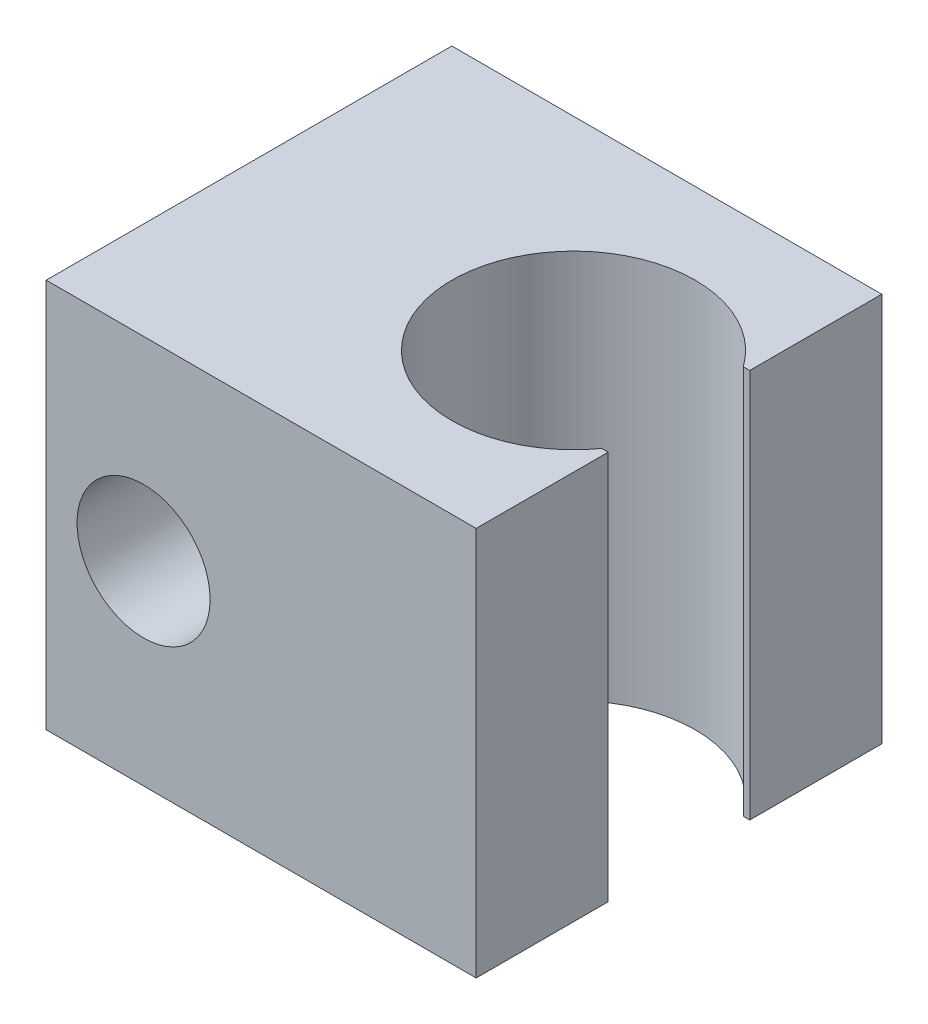
ISO-10303-21;
HEADER;
FILE_DESCRIPTION(('STEP AP214'),'2;1');
FILE_NAME('part.step','',(''),(''),'','','');
FILE_SCHEMA(('AUTOMOTIVE_DESIGN { 1 0 10303 214 1 1 1 1 }'));
ENDSEC;
DATA;
#1=APPLICATION_CONTEXT('core data for automotive mechanical design processes');
#2=APPLICATION_PROTOCOL_DEFINITION('international standard','automotive_design',2000,#1);
#3=PRODUCT_CONTEXT('',#1,'mechanical');
#4=PRODUCT('Part','Part','',(#3));
#5=PRODUCT_RELATED_PRODUCT_CATEGORY('part','',(#4));
#6=PRODUCT_DEFINITION_FORMATION('','',#4);
#7=PRODUCT_DEFINITION_CONTEXT('part definition',#1,'design');
#8=PRODUCT_DEFINITION('design','',#6,#7);
#9=PRODUCT_DEFINITION_SHAPE('','',#8);
#10=(LENGTH_UNIT() NAMED_UNIT(*) SI_UNIT(.MILLI.,.METRE.));
#11=(NAMED_UNIT(*) PLANE_ANGLE_UNIT() SI_UNIT($,.RADIAN.));
#12=(NAMED_UNIT(*) SI_UNIT($,.STERADIAN.) SOLID_ANGLE_UNIT());
#13=UNCERTAINTY_MEASURE_WITH_UNIT(LENGTH_MEASURE(1.E-05),#10,'distance_accuracy_value','');
#14=(GEOMETRIC_REPRESENTATION_CONTEXT(3) GLOBAL_UNCERTAINTY_ASSIGNED_CONTEXT((#13)) GLOBAL_UNIT_ASSIGNED_CONTEXT((#10,
#11,#12)) REPRESENTATION_CONTEXT('',''));
#15=CARTESIAN_POINT('',(0.,0.,0.));
#16=DIRECTION('',(0.,0.,1.));
#17=DIRECTION('',(1.,0.,0.));
#18=AXIS2_PLACEMENT_3D('',#15,#16,#17);
#19=CARTESIAN_POINT('',(0.,24.,-12.5));
#20=DIRECTION('',(0.,0.,-1.));
#21=DIRECTION('',(-1.,0.,0.));
#22=AXIS2_PLACEMENT_3D('',#19,#20,#21);
#23=PLANE('',#22);
#24=CARTESIAN_POINT('',(-14.,12.,-12.5));
#25=DIRECTION('',(0.,0.,-1.));
#26=DIRECTION('',(-1.,0.,0.));
#27=AXIS2_PLACEMENT_3D('',#24,#25,#26);
#28=CIRCLE('',#27,4.1);
#29=CARTESIAN_POINT('',(-18.1,12.,-12.5));
#30=VERTEX_POINT('',#29);
#31=EDGE_CURVE('E134',#30,#30,#28,.T.);
#32=ORIENTED_EDGE('',*,*,#31,.F.);
#33=EDGE_LOOP('',(#32));
#34=FACE_BOUND('',#33,.T.);
#35=DIRECTION('',(0.,-1.,0.));
#36=VECTOR('',#35,1.);
#37=CARTESIAN_POINT('',(6.5,24.,-12.5));
#38=LINE('',#37,#36);
#39=CARTESIAN_POINT('',(6.5,24.,-12.5));
#40=VERTEX_POINT('',#39);
#41=CARTESIAN_POINT('',(6.5,0.,-12.5));
#42=VERTEX_POINT('',#41);
#43=EDGE_CURVE('E157',#40,#42,#38,.T.);
#44=ORIENTED_EDGE('',*,*,#43,.T.);
#45=DIRECTION('',(1.,0.,0.));
#46=VECTOR('',#45,1.);
#47=CARTESIAN_POINT('',(0.,0.,-12.5));
#48=LINE('',#47,#46);
#49=CARTESIAN_POINT('',(-20.,0.,-12.5));
#50=VERTEX_POINT('',#49);
#51=EDGE_CURVE('E124',#50,#42,#48,.T.);
#52=ORIENTED_EDGE('',*,*,#51,.F.);
#53=DIRECTION('',(0.,-1.,0.));
#54=VECTOR('',#53,1.);
#55=CARTESIAN_POINT('',(-20.,24.,-12.5));
#56=LINE('',#55,#54);
#57=CARTESIAN_POINT('',(-20.,24.,-12.5));
#58=VERTEX_POINT('',#57);
#59=EDGE_CURVE('E122',#58,#50,#56,.T.);
#60=ORIENTED_EDGE('',*,*,#59,.F.);
#61=DIRECTION('',(1.,0.,0.));
#62=VECTOR('',#61,1.);
#63=CARTESIAN_POINT('',(0.,24.,-12.5));
#64=LINE('',#63,#62);
#65=EDGE_CURVE('E48',#58,#40,#64,.T.);
#66=ORIENTED_EDGE('',*,*,#65,.T.);
#67=EDGE_LOOP('',(#44,#52,#60,#66));
#68=FACE_BOUND('',#67,.T.);
#69=ADVANCED_FACE('F39',(#34,#68),#23,.T.);
#70=CARTESIAN_POINT('',(0.,24.,0.));
#71=DIRECTION('',(0.,-1.,0.));
#72=DIRECTION('',(0.,0.,-1.));
#73=AXIS2_PLACEMENT_3D('',#70,#71,#72);
#74=CYLINDRICAL_SURFACE('',#73,7.5);
#75=DIRECTION('',(0.,-1.,0.));
#76=VECTOR('',#75,1.);
#77=CARTESIAN_POINT('',(6.1,24.,-4.36348484585429));
#78=LINE('',#77,#76);
#79=CARTESIAN_POINT('',(6.1,24.,-4.36348484585429));
#80=VERTEX_POINT('',#79);
#81=CARTESIAN_POINT('',(6.1,0.,-4.36348484585429));
#82=VERTEX_POINT('',#81);
#83=EDGE_CURVE('E64',#80,#82,#78,.T.);
#84=ORIENTED_EDGE('',*,*,#83,.F.);
#85=CARTESIAN_POINT('',(0.,24.,0.));
#86=DIRECTION('',(0.,1.,0.));
#87=DIRECTION('',(0.,0.,1.));
#88=AXIS2_PLACEMENT_3D('',#85,#86,#87);
#89=CIRCLE('',#88,7.5);
#90=CARTESIAN_POINT('',(6.1,24.,4.36348484585429));
#91=VERTEX_POINT('',#90);
#92=EDGE_CURVE('E119',#80,#91,#89,.T.);
#93=ORIENTED_EDGE('',*,*,#92,.T.);
#94=DIRECTION('',(0.,-1.,0.));
#95=VECTOR('',#94,1.);
#96=CARTESIAN_POINT('',(6.1,24.,4.36348484585429));
#97=LINE('',#96,#95);
#98=CARTESIAN_POINT('',(6.1,0.,4.36348484585429));
#99=VERTEX_POINT('',#98);
#100=EDGE_CURVE('E163',#91,#99,#97,.T.);
#101=ORIENTED_EDGE('',*,*,#100,.T.);
#102=CARTESIAN_POINT('',(0.,0.,0.));
#103=DIRECTION('',(0.,1.,0.));
#104=DIRECTION('',(0.,0.,1.));
#105=AXIS2_PLACEMENT_3D('',#102,#103,#104);
#106=CIRCLE('',#105,7.5);
#107=EDGE_CURVE('E159',#82,#99,#106,.T.);
#108=ORIENTED_EDGE('',*,*,#107,.F.);
#109=EDGE_LOOP('',(#84,#93,#101,#108));
#110=FACE_BOUND('',#109,.T.);
#111=ADVANCED_FACE('F41',(#110),#74,.F.);
#112=CARTESIAN_POINT('',(0.,24.,12.5));
#113=DIRECTION('',(0.,0.,1.));
#114=DIRECTION('',(1.,0.,0.));
#115=AXIS2_PLACEMENT_3D('',#112,#113,#114);
#116=PLANE('',#115);
#117=CARTESIAN_POINT('',(-14.,12.,12.5));
#118=DIRECTION('',(0.,0.,1.));
#119=DIRECTION('',(1.,0.,0.));
#120=AXIS2_PLACEMENT_3D('',#117,#118,#119);
#121=CIRCLE('',#120,4.1);
#122=CARTESIAN_POINT('',(-9.9,12.,12.5));
#123=VERTEX_POINT('',#122);
#124=EDGE_CURVE('E281',#123,#123,#121,.T.);
#125=ORIENTED_EDGE('',*,*,#124,.F.);
#126=EDGE_LOOP('',(#125));
#127=FACE_BOUND('',#126,.T.);
#128=DIRECTION('',(0.,-1.,0.));
#129=VECTOR('',#128,1.);
#130=CARTESIAN_POINT('',(6.5,24.,12.5));
#131=LINE('',#130,#129);
#132=CARTESIAN_POINT('',(6.5,24.,12.5));
#133=VERTEX_POINT('',#132);
#134=CARTESIAN_POINT('',(6.5,0.,12.5));
#135=VERTEX_POINT('',#134);
#136=EDGE_CURVE('E56',#133,#135,#131,.T.);
#137=ORIENTED_EDGE('',*,*,#136,.F.);
#138=DIRECTION('',(-1.,0.,0.));
#139=VECTOR('',#138,1.);
#140=CARTESIAN_POINT('',(0.,24.,12.5));
#141=LINE('',#140,#139);
#142=CARTESIAN_POINT('',(-20.,24.,12.5));
#143=VERTEX_POINT('',#142);
#144=EDGE_CURVE('E11',#133,#143,#141,.T.);
#145=ORIENTED_EDGE('',*,*,#144,.T.);
#146=DIRECTION('',(0.,-1.,0.));
#147=VECTOR('',#146,1.);
#148=CARTESIAN_POINT('',(-20.,24.,12.5));
#149=LINE('',#148,#147);
#150=CARTESIAN_POINT('',(-20.,0.,12.5));
#151=VERTEX_POINT('',#150);
#152=EDGE_CURVE('E128',#143,#151,#149,.T.);
#153=ORIENTED_EDGE('',*,*,#152,.T.);
#154=DIRECTION('',(-1.,0.,0.));
#155=VECTOR('',#154,1.);
#156=CARTESIAN_POINT('',(0.,0.,12.5));
#157=LINE('',#156,#155);
#158=EDGE_CURVE('E43',#135,#151,#157,.T.);
#159=ORIENTED_EDGE('',*,*,#158,.F.);
#160=EDGE_LOOP('',(#137,#145,#153,#159));
#161=FACE_BOUND('',#160,.T.);
#162=ADVANCED_FACE('F178',(#127,#161),#116,.T.);
#163=CARTESIAN_POINT('',(0.,24.,0.));
#164=DIRECTION('',(0.,1.,0.));
#165=DIRECTION('',(0.,0.,1.));
#166=AXIS2_PLACEMENT_3D('',#163,#164,#165);
#167=PLANE('',#166);
#168=DIRECTION('',(0.,0.,-1.));
#169=VECTOR('',#168,1.);
#170=CARTESIAN_POINT('',(6.5,24.,-4.36348484585429));
#171=LINE('',#170,#169);
#172=CARTESIAN_POINT('',(6.5,24.,-4.36348484585429));
#173=VERTEX_POINT('',#172);
#174=EDGE_CURVE('E116',#173,#40,#171,.T.);
#175=ORIENTED_EDGE('',*,*,#174,.T.);
#176=ORIENTED_EDGE('',*,*,#65,.F.);
#177=DIRECTION('',(0.,0.,1.));
#178=VECTOR('',#177,1.);
#179=CARTESIAN_POINT('',(-20.,24.,0.));
#180=LINE('',#179,#178);
#181=EDGE_CURVE('E112',#58,#143,#180,.T.);
#182=ORIENTED_EDGE('',*,*,#181,.T.);
#183=ORIENTED_EDGE('',*,*,#144,.F.);
#184=DIRECTION('',(0.,0.,-1.));
#185=VECTOR('',#184,1.);
#186=CARTESIAN_POINT('',(6.5,24.,12.5));
#187=LINE('',#186,#185);
#188=CARTESIAN_POINT('',(6.5,24.,4.36348484585429));
#189=VERTEX_POINT('',#188);
#190=EDGE_CURVE('E141',#133,#189,#187,.T.);
#191=ORIENTED_EDGE('',*,*,#190,.T.);
#192=DIRECTION('',(-1.,0.,0.));
#193=VECTOR('',#192,1.);
#194=CARTESIAN_POINT('',(6.5,24.,4.36348484585429));
#195=LINE('',#194,#193);
#196=EDGE_CURVE('E144',#189,#91,#195,.T.);
#197=ORIENTED_EDGE('',*,*,#196,.T.);
#198=ORIENTED_EDGE('',*,*,#92,.F.);
#199=DIRECTION('',(1.,0.,0.));
#200=VECTOR('',#199,1.);
#201=CARTESIAN_POINT('',(6.5,24.,-4.36348484585429));
#202=LINE('',#201,#200);
#203=EDGE_CURVE('E148',#80,#173,#202,.T.);
#204=ORIENTED_EDGE('',*,*,#203,.T.);
#205=EDGE_LOOP('',(#175,#176,#182,#183,#191,#197,#198,#204));
#206=FACE_BOUND('',#205,.T.);
#207=ADVANCED_FACE('F109',(#206),#167,.T.);
#208=CARTESIAN_POINT('',(0.,0.,0.));
#209=DIRECTION('',(0.,1.,0.));
#210=DIRECTION('',(0.,0.,1.));
#211=AXIS2_PLACEMENT_3D('',#208,#209,#210);
#212=PLANE('',#211);
#213=ORIENTED_EDGE('',*,*,#51,.T.);
#214=DIRECTION('',(0.,0.,-1.));
#215=VECTOR('',#214,1.);
#216=CARTESIAN_POINT('',(6.5,0.,-4.36348484585429));
#217=LINE('',#216,#215);
#218=CARTESIAN_POINT('',(6.5,0.,-4.36348484585429));
#219=VERTEX_POINT('',#218);
#220=EDGE_CURVE('E145',#219,#42,#217,.T.);
#221=ORIENTED_EDGE('',*,*,#220,.F.);
#222=DIRECTION('',(1.,0.,0.));
#223=VECTOR('',#222,1.);
#224=CARTESIAN_POINT('',(6.5,0.,-4.36348484585429));
#225=LINE('',#224,#223);
#226=EDGE_CURVE('E154',#82,#219,#225,.T.);
#227=ORIENTED_EDGE('',*,*,#226,.F.);
#228=ORIENTED_EDGE('',*,*,#107,.T.);
#229=DIRECTION('',(-1.,0.,0.));
#230=VECTOR('',#229,1.);
#231=CARTESIAN_POINT('',(6.5,0.,4.36348484585429));
#232=LINE('',#231,#230);
#233=CARTESIAN_POINT('',(6.5,0.,4.36348484585429));
#234=VERTEX_POINT('',#233);
#235=EDGE_CURVE('E152',#234,#99,#232,.T.);
#236=ORIENTED_EDGE('',*,*,#235,.F.);
#237=DIRECTION('',(0.,0.,-1.));
#238=VECTOR('',#237,1.);
#239=CARTESIAN_POINT('',(6.5,0.,12.5));
#240=LINE('',#239,#238);
#241=EDGE_CURVE('E139',#135,#234,#240,.T.);
#242=ORIENTED_EDGE('',*,*,#241,.F.);
#243=ORIENTED_EDGE('',*,*,#158,.T.);
#244=DIRECTION('',(0.,0.,1.));
#245=VECTOR('',#244,1.);
#246=CARTESIAN_POINT('',(-20.,0.,0.));
#247=LINE('',#246,#245);
#248=EDGE_CURVE('E132',#50,#151,#247,.T.);
#249=ORIENTED_EDGE('',*,*,#248,.F.);
#250=EDGE_LOOP('',(#213,#221,#227,#228,#236,#242,#243,#249));
#251=FACE_BOUND('',#250,.T.);
#252=ADVANCED_FACE('F175',(#251),#212,.F.);
#253=CARTESIAN_POINT('',(6.5,24.,12.5));
#254=DIRECTION('',(-1.,0.,0.));
#255=DIRECTION('',(0.,0.,1.));
#256=AXIS2_PLACEMENT_3D('',#253,#254,#255);
#257=PLANE('',#256);
#258=ORIENTED_EDGE('',*,*,#241,.T.);
#259=DIRECTION('',(0.,-1.,0.));
#260=VECTOR('',#259,1.);
#261=CARTESIAN_POINT('',(6.5,24.,4.36348484585429));
#262=LINE('',#261,#260);
#263=EDGE_CURVE('E166',#189,#234,#262,.T.);
#264=ORIENTED_EDGE('',*,*,#263,.F.);
#265=ORIENTED_EDGE('',*,*,#190,.F.);
#266=ORIENTED_EDGE('',*,*,#136,.T.);
#267=EDGE_LOOP('',(#258,#264,#265,#266));
#268=FACE_BOUND('',#267,.T.);
#269=ADVANCED_FACE('F181',(#268),#257,.F.);
#270=CARTESIAN_POINT('',(6.5,24.,4.36348484585429));
#271=DIRECTION('',(0.,0.,1.));
#272=DIRECTION('',(1.,0.,0.));
#273=AXIS2_PLACEMENT_3D('',#270,#271,#272);
#274=PLANE('',#273);
#275=ORIENTED_EDGE('',*,*,#235,.T.);
#276=ORIENTED_EDGE('',*,*,#100,.F.);
#277=ORIENTED_EDGE('',*,*,#196,.F.);
#278=ORIENTED_EDGE('',*,*,#263,.T.);
#279=EDGE_LOOP('',(#275,#276,#277,#278));
#280=FACE_BOUND('',#279,.T.);
#281=ADVANCED_FACE('F183',(#280),#274,.F.);
#282=CARTESIAN_POINT('',(6.5,24.,-4.36348484585429));
#283=DIRECTION('',(-1.,0.,0.));
#284=DIRECTION('',(0.,0.,1.));
#285=AXIS2_PLACEMENT_3D('',#282,#283,#284);
#286=PLANE('',#285);
#287=ORIENTED_EDGE('',*,*,#220,.T.);
#288=ORIENTED_EDGE('',*,*,#43,.F.);
#289=ORIENTED_EDGE('',*,*,#174,.F.);
#290=DIRECTION('',(0.,-1.,0.));
#291=VECTOR('',#290,1.);
#292=CARTESIAN_POINT('',(6.5,24.,-4.36348484585429));
#293=LINE('',#292,#291);
#294=EDGE_CURVE('E160',#173,#219,#293,.T.);
#295=ORIENTED_EDGE('',*,*,#294,.T.);
#296=EDGE_LOOP('',(#287,#288,#289,#295));
#297=FACE_BOUND('',#296,.T.);
#298=ADVANCED_FACE('F188',(#297),#286,.F.);
#299=CARTESIAN_POINT('',(6.5,24.,-4.36348484585429));
#300=DIRECTION('',(0.,0.,-1.));
#301=DIRECTION('',(-1.,0.,0.));
#302=AXIS2_PLACEMENT_3D('',#299,#300,#301);
#303=PLANE('',#302);
#304=ORIENTED_EDGE('',*,*,#226,.T.);
#305=ORIENTED_EDGE('',*,*,#294,.F.);
#306=ORIENTED_EDGE('',*,*,#203,.F.);
#307=ORIENTED_EDGE('',*,*,#83,.T.);
#308=EDGE_LOOP('',(#304,#305,#306,#307));
#309=FACE_BOUND('',#308,.T.);
#310=ADVANCED_FACE('F186',(#309),#303,.F.);
#311=CARTESIAN_POINT('',(-20.,24.,0.));
#312=DIRECTION('',(1.,0.,0.));
#313=DIRECTION('',(0.,0.,-1.));
#314=AXIS2_PLACEMENT_3D('',#311,#312,#313);
#315=PLANE('',#314);
#316=ORIENTED_EDGE('',*,*,#248,.T.);
#317=ORIENTED_EDGE('',*,*,#152,.F.);
#318=ORIENTED_EDGE('',*,*,#181,.F.);
#319=ORIENTED_EDGE('',*,*,#59,.T.);
#320=EDGE_LOOP('',(#316,#317,#318,#319));
#321=FACE_BOUND('',#320,.T.);
#322=ADVANCED_FACE('F130',(#321),#315,.F.);
#323=CARTESIAN_POINT('',(-14.,12.,-35.5));
#324=DIRECTION('',(0.,0.,1.));
#325=DIRECTION('',(1.,0.,0.));
#326=AXIS2_PLACEMENT_3D('',#323,#324,#325);
#327=CYLINDRICAL_SURFACE('',#326,4.1);
#328=ORIENTED_EDGE('',*,*,#31,.T.);
#329=EDGE_LOOP('',(#328));
#330=FACE_BOUND('',#329,.T.);
#331=ORIENTED_EDGE('',*,*,#124,.T.);
#332=EDGE_LOOP('',(#331));
#333=FACE_BOUND('',#332,.T.);
#334=ADVANCED_FACE('F254',(#330,#333),#327,.F.);
#335=CLOSED_SHELL('',(#69,#111,#162,#207,#252,#269,#281,#298,#310,#322,#334));
#336=MANIFOLD_SOLID_BREP('B2',#335);
#337=ADVANCED_BREP_SHAPE_REPRESENTATION('',(#18,#336),#14);
#338=SHAPE_DEFINITION_REPRESENTATION(#9,#337);
ENDSEC;
END-ISO-10303-21;
